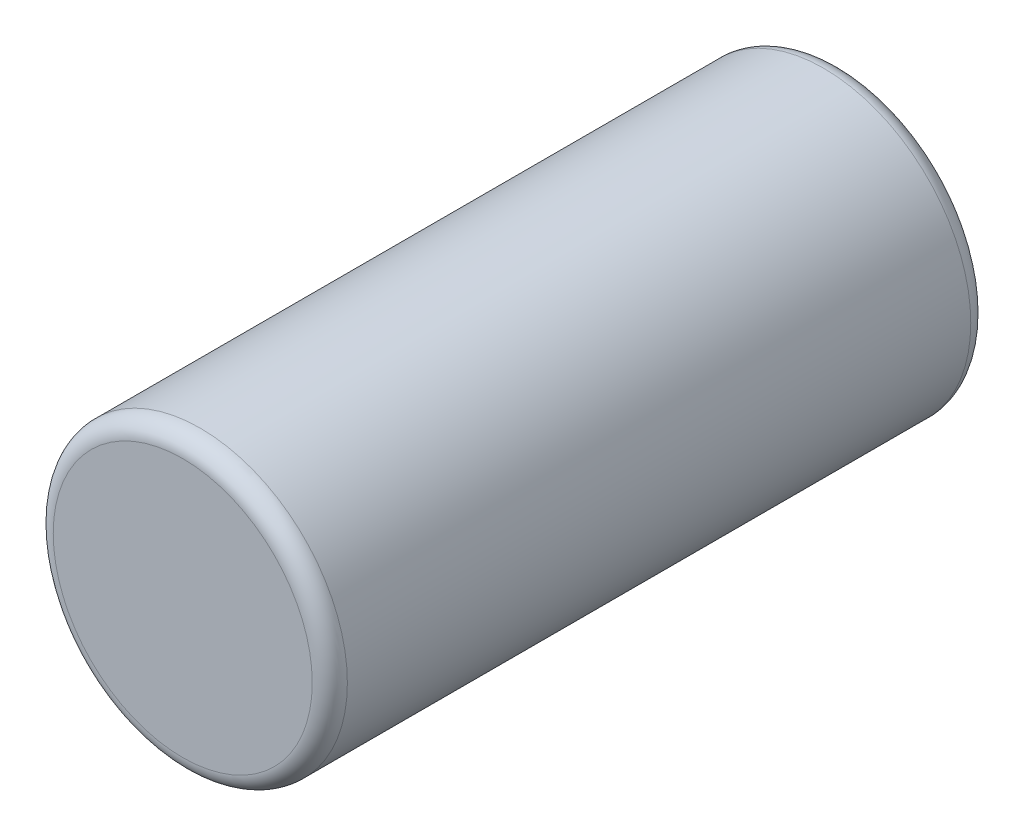
ISO-10303-21;
HEADER;
FILE_DESCRIPTION(('STEP AP214'),'2;1');
FILE_NAME('part.step','',(''),(''),'','','');
FILE_SCHEMA(('AUTOMOTIVE_DESIGN { 1 0 10303 214 1 1 1 1 }'));
ENDSEC;
DATA;
#1=APPLICATION_CONTEXT('core data for automotive mechanical design processes');
#2=APPLICATION_PROTOCOL_DEFINITION('international standard','automotive_design',2000,#1);
#3=PRODUCT_CONTEXT('',#1,'mechanical');
#4=PRODUCT('Part','Part','',(#3));
#5=PRODUCT_RELATED_PRODUCT_CATEGORY('part','',(#4));
#6=PRODUCT_DEFINITION_FORMATION('','',#4);
#7=PRODUCT_DEFINITION_CONTEXT('part definition',#1,'design');
#8=PRODUCT_DEFINITION('design','',#6,#7);
#9=PRODUCT_DEFINITION_SHAPE('','',#8);
#10=(LENGTH_UNIT() NAMED_UNIT(*) SI_UNIT(.MILLI.,.METRE.));
#11=(NAMED_UNIT(*) PLANE_ANGLE_UNIT() SI_UNIT($,.RADIAN.));
#12=(NAMED_UNIT(*) SI_UNIT($,.STERADIAN.) SOLID_ANGLE_UNIT());
#13=UNCERTAINTY_MEASURE_WITH_UNIT(LENGTH_MEASURE(1.E-05),#10,'distance_accuracy_value','');
#14=(GEOMETRIC_REPRESENTATION_CONTEXT(3) GLOBAL_UNCERTAINTY_ASSIGNED_CONTEXT((#13)) GLOBAL_UNIT_ASSIGNED_CONTEXT((#10,
#11,#12)) REPRESENTATION_CONTEXT('',''));
#15=CARTESIAN_POINT('',(0.,0.,0.));
#16=DIRECTION('',(0.,0.,1.));
#17=DIRECTION('',(1.,0.,0.));
#18=AXIS2_PLACEMENT_3D('',#15,#16,#17);
#19=CARTESIAN_POINT('',(0.,0.,15.));
#20=DIRECTION('',(0.,0.,-1.));
#21=DIRECTION('',(-1.,0.,0.));
#22=AXIS2_PLACEMENT_3D('',#19,#20,#21);
#23=CYLINDRICAL_SURFACE('',#22,3.35);
#24=CARTESIAN_POINT('',(0.,0.,0.399999999999999));
#25=DIRECTION('',(0.,0.,1.));
#26=DIRECTION('',(1.,0.,0.));
#27=AXIS2_PLACEMENT_3D('',#24,#25,#26);
#28=CIRCLE('',#27,3.35);
#29=CARTESIAN_POINT('',(3.35,0.,0.399999999999999));
#30=VERTEX_POINT('',#29);
#31=EDGE_CURVE('E42',#30,#30,#28,.T.);
#32=ORIENTED_EDGE('',*,*,#31,.T.);
#33=EDGE_LOOP('',(#32));
#34=FACE_BOUND('',#33,.T.);
#35=CARTESIAN_POINT('',(0.,0.,14.6));
#36=DIRECTION('',(0.,0.,1.));
#37=DIRECTION('',(1.,0.,0.));
#38=AXIS2_PLACEMENT_3D('',#35,#36,#37);
#39=CIRCLE('',#38,3.35);
#40=CARTESIAN_POINT('',(3.35,0.,14.6));
#41=VERTEX_POINT('',#40);
#42=EDGE_CURVE('E46',#41,#41,#39,.F.);
#43=ORIENTED_EDGE('',*,*,#42,.T.);
#44=EDGE_LOOP('',(#43));
#45=FACE_BOUND('',#44,.T.);
#46=ADVANCED_FACE('F31',(#34,#45),#23,.T.);
#47=CARTESIAN_POINT('',(0.,0.,15.));
#48=DIRECTION('',(0.,0.,1.));
#49=DIRECTION('',(1.,0.,0.));
#50=AXIS2_PLACEMENT_3D('',#47,#48,#49);
#51=PLANE('',#50);
#52=CARTESIAN_POINT('',(0.,0.,15.));
#53=DIRECTION('',(0.,0.,1.));
#54=DIRECTION('',(1.,0.,0.));
#55=AXIS2_PLACEMENT_3D('',#52,#53,#54);
#56=CIRCLE('',#55,2.95);
#57=CARTESIAN_POINT('',(2.95,0.,15.));
#58=VERTEX_POINT('',#57);
#59=EDGE_CURVE('E10',#58,#58,#56,.T.);
#60=ORIENTED_EDGE('',*,*,#59,.T.);
#61=EDGE_LOOP('',(#60));
#62=FACE_BOUND('',#61,.T.);
#63=ADVANCED_FACE('F62',(#62),#51,.T.);
#64=CARTESIAN_POINT('',(0.,0.,0.));
#65=DIRECTION('',(0.,0.,1.));
#66=DIRECTION('',(1.,0.,0.));
#67=AXIS2_PLACEMENT_3D('',#64,#65,#66);
#68=PLANE('',#67);
#69=CARTESIAN_POINT('',(0.,0.,0.));
#70=DIRECTION('',(0.,0.,1.));
#71=DIRECTION('',(1.,0.,0.));
#72=AXIS2_PLACEMENT_3D('',#69,#70,#71);
#73=CIRCLE('',#72,2.95);
#74=CARTESIAN_POINT('',(2.95,0.,0.));
#75=VERTEX_POINT('',#74);
#76=EDGE_CURVE('E38',#75,#75,#73,.F.);
#77=ORIENTED_EDGE('',*,*,#76,.T.);
#78=EDGE_LOOP('',(#77));
#79=FACE_BOUND('',#78,.T.);
#80=ADVANCED_FACE('F59',(#79),#68,.F.);
#81=CARTESIAN_POINT('',(0.,0.,0.399999999999999));
#82=DIRECTION('',(0.,0.,1.));
#83=DIRECTION('',(1.,0.,0.));
#84=AXIS2_PLACEMENT_3D('',#81,#82,#83);
#85=TOROIDAL_SURFACE('',#84,2.95,0.4);
#86=ORIENTED_EDGE('',*,*,#76,.F.);
#87=EDGE_LOOP('',(#86));
#88=FACE_BOUND('',#87,.T.);
#89=ORIENTED_EDGE('',*,*,#31,.F.);
#90=EDGE_LOOP('',(#89));
#91=FACE_BOUND('',#90,.T.);
#92=ADVANCED_FACE('F55',(#88,#91),#85,.T.);
#93=CARTESIAN_POINT('',(0.,0.,14.6));
#94=DIRECTION('',(0.,0.,1.));
#95=DIRECTION('',(1.,0.,0.));
#96=AXIS2_PLACEMENT_3D('',#93,#94,#95);
#97=TOROIDAL_SURFACE('',#96,2.95,0.4);
#98=ORIENTED_EDGE('',*,*,#42,.F.);
#99=EDGE_LOOP('',(#98));
#100=FACE_BOUND('',#99,.T.);
#101=ORIENTED_EDGE('',*,*,#59,.F.);
#102=EDGE_LOOP('',(#101));
#103=FACE_BOUND('',#102,.T.);
#104=ADVANCED_FACE('F33',(#100,#103),#97,.T.);
#105=CLOSED_SHELL('',(#46,#63,#80,#92,#104));
#106=MANIFOLD_SOLID_BREP('B2',#105);
#107=ADVANCED_BREP_SHAPE_REPRESENTATION('',(#18,#106),#14);
#108=SHAPE_DEFINITION_REPRESENTATION(#9,#107);
ENDSEC;
END-ISO-10303-21;
